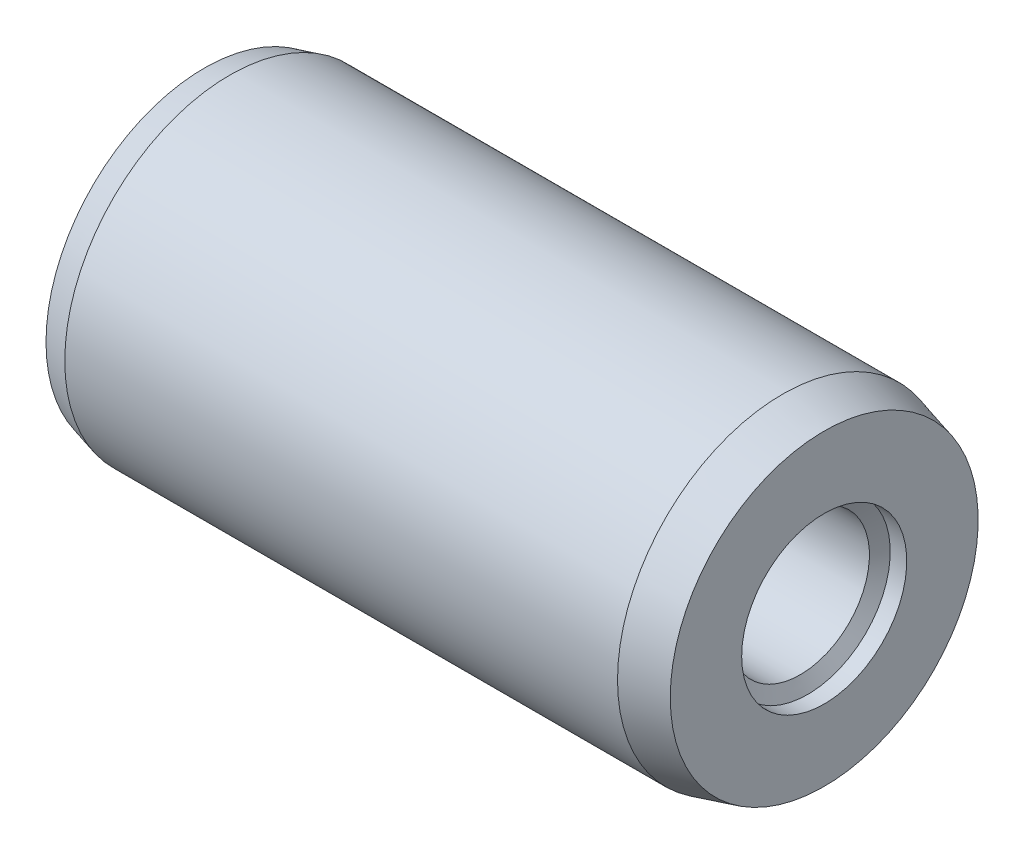
ISO-10303-21;
HEADER;
FILE_DESCRIPTION(('STEP AP214'),'2;1');
FILE_NAME('part.step','',(''),(''),'','','');
FILE_SCHEMA(('AUTOMOTIVE_DESIGN { 1 0 10303 214 1 1 1 1 }'));
ENDSEC;
DATA;
#1=APPLICATION_CONTEXT('core data for automotive mechanical design processes');
#2=APPLICATION_PROTOCOL_DEFINITION('international standard','automotive_design',2000,#1);
#3=PRODUCT_CONTEXT('',#1,'mechanical');
#4=PRODUCT('Part','Part','',(#3));
#5=PRODUCT_RELATED_PRODUCT_CATEGORY('part','',(#4));
#6=PRODUCT_DEFINITION_FORMATION('','',#4);
#7=PRODUCT_DEFINITION_CONTEXT('part definition',#1,'design');
#8=PRODUCT_DEFINITION('design','',#6,#7);
#9=PRODUCT_DEFINITION_SHAPE('','',#8);
#10=(LENGTH_UNIT() NAMED_UNIT(*) SI_UNIT(.MILLI.,.METRE.));
#11=(NAMED_UNIT(*) PLANE_ANGLE_UNIT() SI_UNIT($,.RADIAN.));
#12=(NAMED_UNIT(*) SI_UNIT($,.STERADIAN.) SOLID_ANGLE_UNIT());
#13=UNCERTAINTY_MEASURE_WITH_UNIT(LENGTH_MEASURE(1.E-05),#10,'distance_accuracy_value','');
#14=(GEOMETRIC_REPRESENTATION_CONTEXT(3) GLOBAL_UNCERTAINTY_ASSIGNED_CONTEXT((#13)) GLOBAL_UNIT_ASSIGNED_CONTEXT((#10,
#11,#12)) REPRESENTATION_CONTEXT('',''));
#15=CARTESIAN_POINT('',(0.,0.,0.));
#16=DIRECTION('',(0.,0.,1.));
#17=DIRECTION('',(1.,0.,0.));
#18=AXIS2_PLACEMENT_3D('',#15,#16,#17);
#19=CARTESIAN_POINT('',(10.,0.,0.));
#20=DIRECTION('',(1.,0.,0.));
#21=DIRECTION('',(0.,0.,-1.));
#22=AXIS2_PLACEMENT_3D('',#19,#20,#21);
#23=CONICAL_SURFACE('',#22,25.,0.261799387799143);
#24=CARTESIAN_POINT('',(10.,0.,0.));
#25=DIRECTION('',(-1.,0.,0.));
#26=DIRECTION('',(0.,0.,1.));
#27=AXIS2_PLACEMENT_3D('',#24,#25,#26);
#28=CIRCLE('',#27,25.);
#29=CARTESIAN_POINT('',(10.,0.,25.));
#30=VERTEX_POINT('',#29);
#31=EDGE_CURVE('E11',#30,#30,#28,.T.);
#32=ORIENTED_EDGE('',*,*,#31,.T.);
#33=EDGE_LOOP('',(#32));
#34=FACE_BOUND('',#33,.T.);
#35=CARTESIAN_POINT('',(6.1140356406475,0.,0.));
#36=DIRECTION('',(-1.,0.,0.));
#37=DIRECTION('',(0.,0.,1.));
#38=AXIS2_PLACEMENT_3D('',#35,#36,#37);
#39=CIRCLE('',#38,23.9587589880954);
#40=CARTESIAN_POINT('',(6.1140356406475,0.,23.9587589880954));
#41=VERTEX_POINT('',#40);
#42=EDGE_CURVE('E54',#41,#41,#39,.T.);
#43=ORIENTED_EDGE('',*,*,#42,.F.);
#44=EDGE_LOOP('',(#43));
#45=FACE_BOUND('',#44,.T.);
#46=ADVANCED_FACE('F34',(#34,#45),#23,.T.);
#47=CARTESIAN_POINT('',(-10.,0.,0.));
#48=DIRECTION('',(-1.,0.,0.));
#49=DIRECTION('',(0.,0.,1.));
#50=AXIS2_PLACEMENT_3D('',#47,#48,#49);
#51=CYLINDRICAL_SURFACE('',#50,25.);
#52=ORIENTED_EDGE('',*,*,#31,.F.);
#53=EDGE_LOOP('',(#52));
#54=FACE_BOUND('',#53,.T.);
#55=CARTESIAN_POINT('',(93.7,0.,0.));
#56=DIRECTION('',(-1.,0.,0.));
#57=DIRECTION('',(0.,0.,1.));
#58=AXIS2_PLACEMENT_3D('',#55,#56,#57);
#59=CIRCLE('',#58,25.);
#60=CARTESIAN_POINT('',(93.7,0.,25.));
#61=VERTEX_POINT('',#60);
#62=EDGE_CURVE('E41',#61,#61,#59,.T.);
#63=ORIENTED_EDGE('',*,*,#62,.T.);
#64=EDGE_LOOP('',(#63));
#65=FACE_BOUND('',#64,.T.);
#66=ADVANCED_FACE('F75',(#54,#65),#51,.T.);
#67=CARTESIAN_POINT('',(100.,0.,0.));
#68=DIRECTION('',(-1.,0.,0.));
#69=DIRECTION('',(0.,0.,1.));
#70=AXIS2_PLACEMENT_3D('',#67,#68,#69);
#71=CONICAL_SURFACE('',#70,23.3119200876839,0.261799387799154);
#72=ORIENTED_EDGE('',*,*,#62,.F.);
#73=EDGE_LOOP('',(#72));
#74=FACE_BOUND('',#73,.T.);
#75=CARTESIAN_POINT('',(100.,0.,0.));
#76=DIRECTION('',(-1.,0.,0.));
#77=DIRECTION('',(0.,0.,1.));
#78=AXIS2_PLACEMENT_3D('',#75,#76,#77);
#79=CIRCLE('',#78,23.3119200876839);
#80=CARTESIAN_POINT('',(100.,0.,23.3119200876839));
#81=VERTEX_POINT('',#80);
#82=EDGE_CURVE('E70',#81,#81,#79,.T.);
#83=ORIENTED_EDGE('',*,*,#82,.T.);
#84=EDGE_LOOP('',(#83));
#85=FACE_BOUND('',#84,.T.);
#86=ADVANCED_FACE('F77',(#74,#85),#71,.T.);
#87=CARTESIAN_POINT('',(100.,23.3119200876839,0.));
#88=DIRECTION('',(-1.,0.,0.));
#89=DIRECTION('',(0.,0.,1.));
#90=AXIS2_PLACEMENT_3D('',#87,#88,#89);
#91=PLANE('',#90);
#92=ORIENTED_EDGE('',*,*,#82,.F.);
#93=EDGE_LOOP('',(#92));
#94=FACE_BOUND('',#93,.T.);
#95=CARTESIAN_POINT('',(100.,0.,0.));
#96=DIRECTION('',(-1.,0.,0.));
#97=DIRECTION('',(0.,0.,1.));
#98=AXIS2_PLACEMENT_3D('',#95,#96,#97);
#99=CIRCLE('',#98,12.5);
#100=CARTESIAN_POINT('',(100.,0.,12.5));
#101=VERTEX_POINT('',#100);
#102=EDGE_CURVE('E67',#101,#101,#99,.T.);
#103=ORIENTED_EDGE('',*,*,#102,.T.);
#104=EDGE_LOOP('',(#103));
#105=FACE_BOUND('',#104,.T.);
#106=ADVANCED_FACE('F80',(#94,#105),#91,.F.);
#107=CARTESIAN_POINT('',(-10.,0.,0.));
#108=DIRECTION('',(-1.,0.,0.));
#109=DIRECTION('',(0.,0.,1.));
#110=AXIS2_PLACEMENT_3D('',#107,#108,#109);
#111=CYLINDRICAL_SURFACE('',#110,12.5);
#112=ORIENTED_EDGE('',*,*,#102,.F.);
#113=EDGE_LOOP('',(#112));
#114=FACE_BOUND('',#113,.T.);
#115=CARTESIAN_POINT('',(97.5,0.,0.));
#116=DIRECTION('',(-1.,0.,0.));
#117=DIRECTION('',(0.,0.,1.));
#118=AXIS2_PLACEMENT_3D('',#115,#116,#117);
#119=CIRCLE('',#118,12.5);
#120=CARTESIAN_POINT('',(97.5,0.,12.5));
#121=VERTEX_POINT('',#120);
#122=EDGE_CURVE('E64',#121,#121,#119,.T.);
#123=ORIENTED_EDGE('',*,*,#122,.T.);
#124=EDGE_LOOP('',(#123));
#125=FACE_BOUND('',#124,.T.);
#126=ADVANCED_FACE('F86',(#114,#125),#111,.F.);
#127=CARTESIAN_POINT('',(96.3452994616207,0.,0.));
#128=DIRECTION('',(1.,0.,0.));
#129=DIRECTION('',(0.,0.,-1.));
#130=AXIS2_PLACEMENT_3D('',#127,#128,#129);
#131=CONICAL_SURFACE('',#130,10.5,1.04719755119659);
#132=ORIENTED_EDGE('',*,*,#122,.F.);
#133=EDGE_LOOP('',(#132));
#134=FACE_BOUND('',#133,.T.);
#135=CARTESIAN_POINT('',(96.3452994616207,0.,0.));
#136=DIRECTION('',(-1.,0.,0.));
#137=DIRECTION('',(0.,0.,1.));
#138=AXIS2_PLACEMENT_3D('',#135,#136,#137);
#139=CIRCLE('',#138,10.5);
#140=CARTESIAN_POINT('',(96.3452994616207,0.,10.5));
#141=VERTEX_POINT('',#140);
#142=EDGE_CURVE('E59',#141,#141,#139,.T.);
#143=ORIENTED_EDGE('',*,*,#142,.T.);
#144=EDGE_LOOP('',(#143));
#145=FACE_BOUND('',#144,.T.);
#146=ADVANCED_FACE('F92',(#134,#145),#131,.F.);
#147=CARTESIAN_POINT('',(-10.,0.,0.));
#148=DIRECTION('',(-1.,0.,0.));
#149=DIRECTION('',(0.,0.,1.));
#150=AXIS2_PLACEMENT_3D('',#147,#148,#149);
#151=CYLINDRICAL_SURFACE('',#150,10.5);
#152=ORIENTED_EDGE('',*,*,#142,.F.);
#153=EDGE_LOOP('',(#152));
#154=FACE_BOUND('',#153,.T.);
#155=CARTESIAN_POINT('',(50.,0.,0.));
#156=DIRECTION('',(-1.,0.,0.));
#157=DIRECTION('',(0.,0.,1.));
#158=AXIS2_PLACEMENT_3D('',#155,#156,#157);
#159=CIRCLE('',#158,10.5);
#160=CARTESIAN_POINT('',(50.,0.,10.5));
#161=VERTEX_POINT('',#160);
#162=EDGE_CURVE('E56',#161,#161,#159,.T.);
#163=ORIENTED_EDGE('',*,*,#162,.T.);
#164=EDGE_LOOP('',(#163));
#165=FACE_BOUND('',#164,.T.);
#166=ADVANCED_FACE('F98',(#154,#165),#151,.F.);
#167=CARTESIAN_POINT('',(43.6909635002106,0.,0.));
#168=DIRECTION('',(1.,0.,0.));
#169=DIRECTION('',(0.,0.,-1.));
#170=AXIS2_PLACEMENT_3D('',#167,#168,#169);
#171=CONICAL_SURFACE('',#170,0.,1.02974425867666);
#172=ORIENTED_EDGE('',*,*,#162,.F.);
#173=EDGE_LOOP('',(#172));
#174=FACE_BOUND('',#173,.T.);
#175=CARTESIAN_POINT('',(43.6909635002106,0.,0.));
#176=VERTEX_POINT('',#175);
#177=VERTEX_LOOP('',#176);
#178=FACE_BOUND('',#177,.T.);
#179=ADVANCED_FACE('F50',(#174,#178),#171,.F.);
#180=CARTESIAN_POINT('',(50.,0.,0.));
#181=DIRECTION('',(-1.,0.,0.));
#182=DIRECTION('',(0.,-1.,0.));
#183=AXIS2_PLACEMENT_3D('',#180,#181,#182);
#184=SPHERICAL_SURFACE('',#183,50.);
#185=CARTESIAN_POINT('',(0.,0.,0.));
#186=VERTEX_POINT('',#185);
#187=VERTEX_LOOP('',#186);
#188=FACE_BOUND('',#187,.T.);
#189=ORIENTED_EDGE('',*,*,#42,.T.);
#190=EDGE_LOOP('',(#189));
#191=FACE_BOUND('',#190,.T.);
#192=ADVANCED_FACE('F47',(#188,#191),#184,.T.);
#193=CLOSED_SHELL('',(#46,#66,#86,#106,#126,#146,#166,#179,#192));
#194=MANIFOLD_SOLID_BREP('B2',#193);
#195=ADVANCED_BREP_SHAPE_REPRESENTATION('',(#18,#194),#14);
#196=SHAPE_DEFINITION_REPRESENTATION(#9,#195);
ENDSEC;
END-ISO-10303-21;
